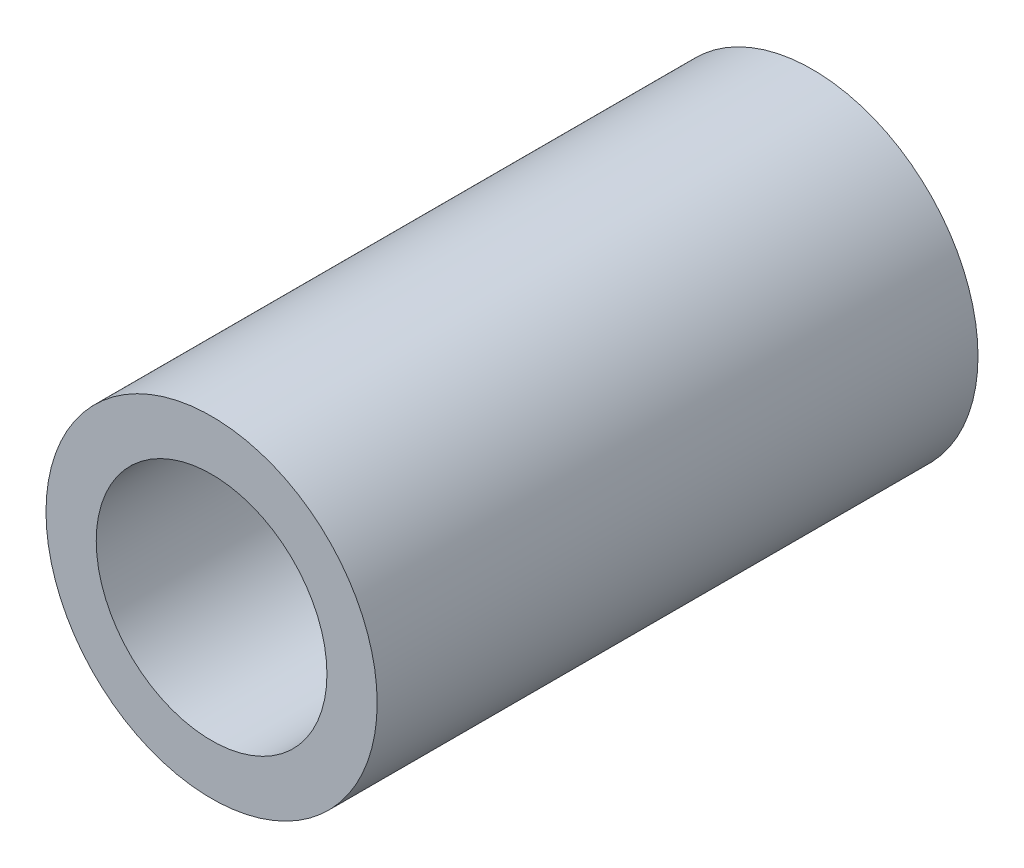
ISO-10303-21;
HEADER;
FILE_DESCRIPTION(('STEP AP214'),'2;1');
FILE_NAME('part.step','',(''),(''),'','','');
FILE_SCHEMA(('AUTOMOTIVE_DESIGN { 1 0 10303 214 1 1 1 1 }'));
ENDSEC;
DATA;
#1=APPLICATION_CONTEXT('core data for automotive mechanical design processes');
#2=APPLICATION_PROTOCOL_DEFINITION('international standard','automotive_design',2000,#1);
#3=PRODUCT_CONTEXT('',#1,'mechanical');
#4=PRODUCT('Part','Part','',(#3));
#5=PRODUCT_RELATED_PRODUCT_CATEGORY('part','',(#4));
#6=PRODUCT_DEFINITION_FORMATION('','',#4);
#7=PRODUCT_DEFINITION_CONTEXT('part definition',#1,'design');
#8=PRODUCT_DEFINITION('design','',#6,#7);
#9=PRODUCT_DEFINITION_SHAPE('','',#8);
#10=(LENGTH_UNIT() NAMED_UNIT(*) SI_UNIT(.MILLI.,.METRE.));
#11=(NAMED_UNIT(*) PLANE_ANGLE_UNIT() SI_UNIT($,.RADIAN.));
#12=(NAMED_UNIT(*) SI_UNIT($,.STERADIAN.) SOLID_ANGLE_UNIT());
#13=UNCERTAINTY_MEASURE_WITH_UNIT(LENGTH_MEASURE(1.E-05),#10,'distance_accuracy_value','');
#14=(GEOMETRIC_REPRESENTATION_CONTEXT(3) GLOBAL_UNCERTAINTY_ASSIGNED_CONTEXT((#13)) GLOBAL_UNIT_ASSIGNED_CONTEXT((#10,
#11,#12)) REPRESENTATION_CONTEXT('',''));
#15=CARTESIAN_POINT('',(0.,0.,0.));
#16=DIRECTION('',(0.,0.,1.));
#17=DIRECTION('',(1.,0.,0.));
#18=AXIS2_PLACEMENT_3D('',#15,#16,#17);
#19=CARTESIAN_POINT('',(0.,0.,6.35));
#20=DIRECTION('',(0.,0.,-1.));
#21=DIRECTION('',(-1.,0.,0.));
#22=AXIS2_PLACEMENT_3D('',#19,#20,#21);
#23=CYLINDRICAL_SURFACE('',#22,1.75);
#24=CARTESIAN_POINT('',(0.,0.,6.35));
#25=DIRECTION('',(0.,0.,1.));
#26=DIRECTION('',(1.,0.,0.));
#27=AXIS2_PLACEMENT_3D('',#24,#25,#26);
#28=CIRCLE('',#27,1.75);
#29=CARTESIAN_POINT('',(1.75,0.,6.35));
#30=VERTEX_POINT('',#29);
#31=EDGE_CURVE('E10',#30,#30,#28,.T.);
#32=ORIENTED_EDGE('',*,*,#31,.F.);
#33=EDGE_LOOP('',(#32));
#34=FACE_BOUND('',#33,.T.);
#35=CARTESIAN_POINT('',(0.,0.,0.));
#36=DIRECTION('',(0.,0.,1.));
#37=DIRECTION('',(1.,0.,0.));
#38=AXIS2_PLACEMENT_3D('',#35,#36,#37);
#39=CIRCLE('',#38,1.75);
#40=CARTESIAN_POINT('',(1.75,0.,0.));
#41=VERTEX_POINT('',#40);
#42=EDGE_CURVE('E36',#41,#41,#39,.T.);
#43=ORIENTED_EDGE('',*,*,#42,.T.);
#44=EDGE_LOOP('',(#43));
#45=FACE_BOUND('',#44,.T.);
#46=ADVANCED_FACE('F33',(#34,#45),#23,.T.);
#47=CARTESIAN_POINT('',(0.,0.,6.35));
#48=DIRECTION('',(0.,0.,1.));
#49=DIRECTION('',(1.,0.,0.));
#50=AXIS2_PLACEMENT_3D('',#47,#48,#49);
#51=PLANE('',#50);
#52=CARTESIAN_POINT('',(0.,0.,6.35));
#53=DIRECTION('',(0.,0.,-1.));
#54=DIRECTION('',(-1.,0.,0.));
#55=AXIS2_PLACEMENT_3D('',#52,#53,#54);
#56=CIRCLE('',#55,1.2192);
#57=CARTESIAN_POINT('',(-1.2192,0.,6.35));
#58=VERTEX_POINT('',#57);
#59=EDGE_CURVE('E43',#58,#58,#56,.T.);
#60=ORIENTED_EDGE('',*,*,#59,.T.);
#61=EDGE_LOOP('',(#60));
#62=FACE_BOUND('',#61,.T.);
#63=ORIENTED_EDGE('',*,*,#31,.T.);
#64=EDGE_LOOP('',(#63));
#65=FACE_BOUND('',#64,.T.);
#66=ADVANCED_FACE('F56',(#62,#65),#51,.T.);
#67=CARTESIAN_POINT('',(0.,0.,0.));
#68=DIRECTION('',(0.,0.,1.));
#69=DIRECTION('',(1.,0.,0.));
#70=AXIS2_PLACEMENT_3D('',#67,#68,#69);
#71=PLANE('',#70);
#72=CARTESIAN_POINT('',(0.,0.,0.));
#73=DIRECTION('',(0.,0.,-1.));
#74=DIRECTION('',(-1.,0.,0.));
#75=AXIS2_PLACEMENT_3D('',#72,#73,#74);
#76=CIRCLE('',#75,1.2192);
#77=CARTESIAN_POINT('',(-1.2192,0.,0.));
#78=VERTEX_POINT('',#77);
#79=EDGE_CURVE('E47',#78,#78,#76,.T.);
#80=ORIENTED_EDGE('',*,*,#79,.F.);
#81=EDGE_LOOP('',(#80));
#82=FACE_BOUND('',#81,.T.);
#83=ORIENTED_EDGE('',*,*,#42,.F.);
#84=EDGE_LOOP('',(#83));
#85=FACE_BOUND('',#84,.T.);
#86=ADVANCED_FACE('F53',(#82,#85),#71,.F.);
#87=CARTESIAN_POINT('',(0.,0.,0.));
#88=DIRECTION('',(0.,0.,-1.));
#89=DIRECTION('',(-1.,0.,0.));
#90=AXIS2_PLACEMENT_3D('',#87,#88,#89);
#91=CYLINDRICAL_SURFACE('',#90,1.2192);
#92=ORIENTED_EDGE('',*,*,#59,.F.);
#93=EDGE_LOOP('',(#92));
#94=FACE_BOUND('',#93,.T.);
#95=ORIENTED_EDGE('',*,*,#79,.T.);
#96=EDGE_LOOP('',(#95));
#97=FACE_BOUND('',#96,.T.);
#98=ADVANCED_FACE('F51',(#94,#97),#91,.F.);
#99=CLOSED_SHELL('',(#46,#66,#86,#98));
#100=MANIFOLD_SOLID_BREP('B2',#99);
#101=ADVANCED_BREP_SHAPE_REPRESENTATION('',(#18,#100),#14);
#102=SHAPE_DEFINITION_REPRESENTATION(#9,#101);
ENDSEC;
END-ISO-10303-21;
